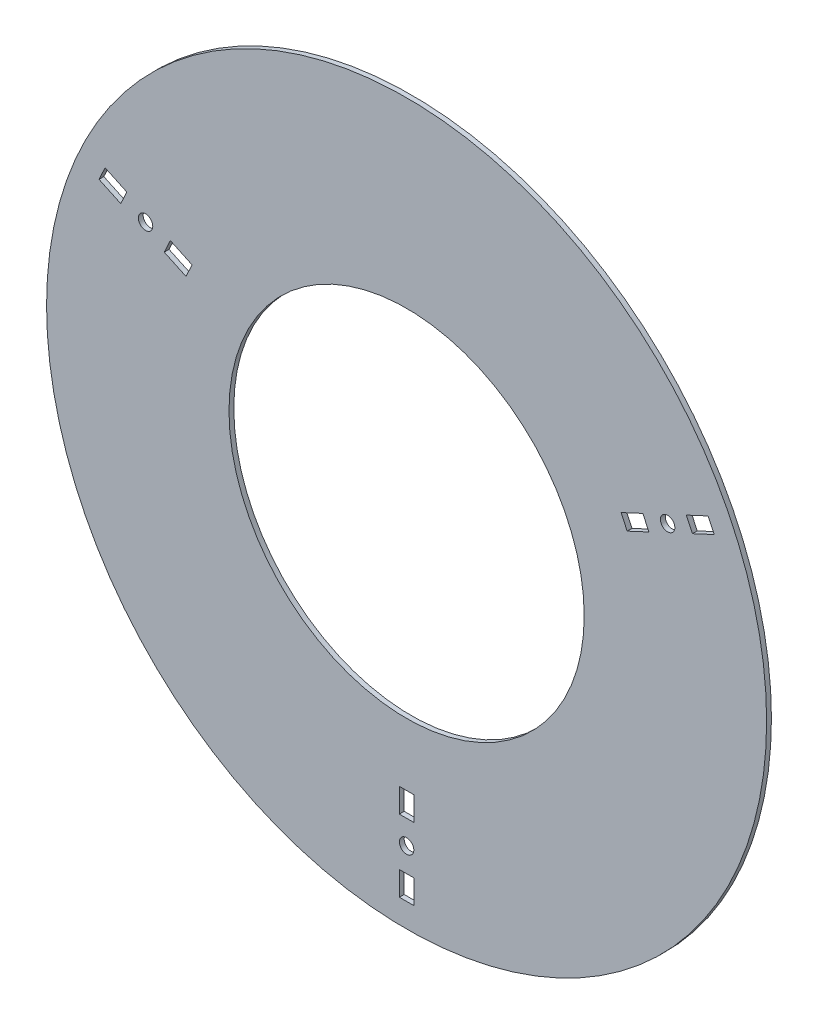
ISO-10303-21;
HEADER;
FILE_DESCRIPTION(('STEP AP214'),'2;1');
FILE_NAME('part.step','',(''),(''),'','','');
FILE_SCHEMA(('AUTOMOTIVE_DESIGN { 1 0 10303 214 1 1 1 1 }'));
ENDSEC;
DATA;
#1=APPLICATION_CONTEXT('core data for automotive mechanical design processes');
#2=APPLICATION_PROTOCOL_DEFINITION('international standard','automotive_design',2000,#1);
#3=PRODUCT_CONTEXT('',#1,'mechanical');
#4=PRODUCT('Part','Part','',(#3));
#5=PRODUCT_RELATED_PRODUCT_CATEGORY('part','',(#4));
#6=PRODUCT_DEFINITION_FORMATION('','',#4);
#7=PRODUCT_DEFINITION_CONTEXT('part definition',#1,'design');
#8=PRODUCT_DEFINITION('design','',#6,#7);
#9=PRODUCT_DEFINITION_SHAPE('','',#8);
#10=(LENGTH_UNIT() NAMED_UNIT(*) SI_UNIT(.MILLI.,.METRE.));
#11=(NAMED_UNIT(*) PLANE_ANGLE_UNIT() SI_UNIT($,.RADIAN.));
#12=(NAMED_UNIT(*) SI_UNIT($,.STERADIAN.) SOLID_ANGLE_UNIT());
#13=UNCERTAINTY_MEASURE_WITH_UNIT(LENGTH_MEASURE(1.E-05),#10,'distance_accuracy_value','');
#14=(GEOMETRIC_REPRESENTATION_CONTEXT(3) GLOBAL_UNCERTAINTY_ASSIGNED_CONTEXT((#13)) GLOBAL_UNIT_ASSIGNED_CONTEXT((#10,
#11,#12)) REPRESENTATION_CONTEXT('',''));
#15=CARTESIAN_POINT('',(0.,0.,0.));
#16=DIRECTION('',(0.,0.,1.));
#17=DIRECTION('',(1.,0.,0.));
#18=AXIS2_PLACEMENT_3D('',#15,#16,#17);
#19=CARTESIAN_POINT('',(0.,0.,1.));
#20=DIRECTION('',(0.,0.,1.));
#21=DIRECTION('',(1.,0.,0.));
#22=AXIS2_PLACEMENT_3D('',#19,#20,#21);
#23=PLANE('',#22);
#24=DIRECTION('',(0.906307787036649,-0.422618261740702,0.));
#25=VECTOR('',#24,1.);
#26=CARTESIAN_POINT('',(-50.4808556796267,21.8845427151837,1.));
#27=LINE('',#26,#25);
#28=CARTESIAN_POINT('',(-50.4808556796267,21.8845427151837,1.));
#29=VERTEX_POINT('',#28);
#30=CARTESIAN_POINT('',(-45.9493167444435,19.7714514064802,1.));
#31=VERTEX_POINT('',#30);
#32=EDGE_CURVE('E202',#29,#31,#27,.T.);
#33=ORIENTED_EDGE('',*,*,#32,.F.);
#34=DIRECTION('',(-0.422618261740704,-0.906307787036648,0.));
#35=VECTOR('',#34,1.);
#36=CARTESIAN_POINT('',(-49.2130008944046,24.6034660762937,1.));
#37=LINE('',#36,#35);
#38=CARTESIAN_POINT('',(-49.2130008944046,24.6034660762937,1.));
#39=VERTEX_POINT('',#38);
#40=EDGE_CURVE('E194',#39,#29,#37,.T.);
#41=ORIENTED_EDGE('',*,*,#40,.F.);
#42=DIRECTION('',(-0.906307787036648,0.422618261740704,0.));
#43=VECTOR('',#42,1.);
#44=CARTESIAN_POINT('',(-49.2130008944046,24.6034660762937,1.));
#45=LINE('',#44,#43);
#46=CARTESIAN_POINT('',(-44.6814619592213,22.4903747675901,1.));
#47=VERTEX_POINT('',#46);
#48=EDGE_CURVE('E217',#47,#39,#45,.T.);
#49=ORIENTED_EDGE('',*,*,#48,.F.);
#50=DIRECTION('',(0.422618261740703,0.906307787036648,0.));
#51=VECTOR('',#50,1.);
#52=CARTESIAN_POINT('',(-44.6814619592213,22.4903747675901,1.));
#53=LINE('',#52,#51);
#54=EDGE_CURVE('E215',#31,#47,#53,.T.);
#55=ORIENTED_EDGE('',*,*,#54,.F.);
#56=EDGE_LOOP('',(#33,#41,#49,#55));
#57=FACE_BOUND('',#56,.T.);
#58=DIRECTION('',(-0.906307787036649,0.422618261740702,0.));
#59=VECTOR('',#58,1.);
#60=CARTESIAN_POINT('',(-58.2760787647711,28.8296486937007,1.));
#61=LINE('',#60,#59);
#62=CARTESIAN_POINT('',(-58.2760787647711,28.8296486937007,1.));
#63=VERTEX_POINT('',#62);
#64=CARTESIAN_POINT('',(-62.8076176999543,30.9427400024042,1.));
#65=VERTEX_POINT('',#64);
#66=EDGE_CURVE('E235',#63,#65,#61,.T.);
#67=ORIENTED_EDGE('',*,*,#66,.F.);
#68=DIRECTION('',(0.422618261740704,0.906307787036648,0.));
#69=VECTOR('',#68,1.);
#70=CARTESIAN_POINT('',(-58.2760787647711,28.8296486937007,1.));
#71=LINE('',#70,#69);
#72=CARTESIAN_POINT('',(-59.5439335499932,26.1107253325907,1.));
#73=VERTEX_POINT('',#72);
#74=EDGE_CURVE('E233',#73,#63,#71,.T.);
#75=ORIENTED_EDGE('',*,*,#74,.F.);
#76=DIRECTION('',(0.906307787036648,-0.422618261740704,0.));
#77=VECTOR('',#76,1.);
#78=CARTESIAN_POINT('',(-59.5439335499932,26.1107253325907,1.));
#79=LINE('',#78,#77);
#80=CARTESIAN_POINT('',(-64.0754724851764,28.2238166412943,1.));
#81=VERTEX_POINT('',#80);
#82=EDGE_CURVE('E241',#81,#73,#79,.T.);
#83=ORIENTED_EDGE('',*,*,#82,.F.);
#84=DIRECTION('',(-0.422618261740703,-0.906307787036648,0.));
#85=VECTOR('',#84,1.);
#86=CARTESIAN_POINT('',(-62.8076176999543,30.9427400024042,1.));
#87=LINE('',#86,#85);
#88=EDGE_CURVE('E238',#65,#81,#87,.T.);
#89=ORIENTED_EDGE('',*,*,#88,.F.);
#90=EDGE_LOOP('',(#67,#75,#83,#89));
#91=FACE_BOUND('',#90,.T.);
#92=CARTESIAN_POINT('',(54.3784672221989,25.3570957044422,1.));
#93=DIRECTION('',(0.,0.,1.));
#94=DIRECTION('',(1.,0.,0.));
#95=AXIS2_PLACEMENT_3D('',#92,#93,#94);
#96=CIRCLE('',#95,1.5);
#97=CARTESIAN_POINT('',(55.8784672221989,25.3570957044422,1.));
#98=VERTEX_POINT('',#97);
#99=EDGE_CURVE('E264',#98,#98,#96,.T.);
#100=ORIENTED_EDGE('',*,*,#99,.F.);
#101=EDGE_LOOP('',(#100));
#102=FACE_BOUND('',#101,.T.);
#103=DIRECTION('',(0.,-1.,0.));
#104=VECTOR('',#103,1.);
#105=CARTESIAN_POINT('',(-1.5,-65.,1.));
#106=LINE('',#105,#104);
#107=CARTESIAN_POINT('',(-1.5,-65.,1.));
#108=VERTEX_POINT('',#107);
#109=CARTESIAN_POINT('',(-1.5,-70.,1.));
#110=VERTEX_POINT('',#109);
#111=EDGE_CURVE('E340',#108,#110,#106,.T.);
#112=ORIENTED_EDGE('',*,*,#111,.F.);
#113=DIRECTION('',(-1.,0.,0.));
#114=VECTOR('',#113,1.);
#115=CARTESIAN_POINT('',(1.5,-65.,1.));
#116=LINE('',#115,#114);
#117=CARTESIAN_POINT('',(1.5,-65.,1.));
#118=VERTEX_POINT('',#117);
#119=EDGE_CURVE('E338',#118,#108,#116,.T.);
#120=ORIENTED_EDGE('',*,*,#119,.F.);
#121=DIRECTION('',(0.,1.,0.));
#122=VECTOR('',#121,1.);
#123=CARTESIAN_POINT('',(1.5,-65.,1.));
#124=LINE('',#123,#122);
#125=CARTESIAN_POINT('',(1.5,-70.,1.));
#126=VERTEX_POINT('',#125);
#127=EDGE_CURVE('E346',#126,#118,#124,.T.);
#128=ORIENTED_EDGE('',*,*,#127,.F.);
#129=DIRECTION('',(1.,0.,0.));
#130=VECTOR('',#129,1.);
#131=CARTESIAN_POINT('',(1.5,-70.,1.));
#132=LINE('',#131,#130);
#133=EDGE_CURVE('E343',#110,#126,#132,.T.);
#134=ORIENTED_EDGE('',*,*,#133,.F.);
#135=EDGE_LOOP('',(#112,#120,#128,#134));
#136=FACE_BOUND('',#135,.T.);
#137=DIRECTION('',(0.,1.,0.));
#138=VECTOR('',#137,1.);
#139=CARTESIAN_POINT('',(1.5,-55.,1.));
#140=LINE('',#139,#138);
#141=CARTESIAN_POINT('',(1.5,-55.,1.));
#142=VERTEX_POINT('',#141);
#143=CARTESIAN_POINT('',(1.5,-50.,1.));
#144=VERTEX_POINT('',#143);
#145=EDGE_CURVE('E371',#142,#144,#140,.T.);
#146=ORIENTED_EDGE('',*,*,#145,.F.);
#147=DIRECTION('',(1.,0.,0.));
#148=VECTOR('',#147,1.);
#149=CARTESIAN_POINT('',(1.5,-55.,1.));
#150=LINE('',#149,#148);
#151=CARTESIAN_POINT('',(-1.5,-55.,1.));
#152=VERTEX_POINT('',#151);
#153=EDGE_CURVE('E369',#152,#142,#150,.T.);
#154=ORIENTED_EDGE('',*,*,#153,.F.);
#155=DIRECTION('',(0.,-1.,0.));
#156=VECTOR('',#155,1.);
#157=CARTESIAN_POINT('',(-1.5,-55.,1.));
#158=LINE('',#157,#156);
#159=CARTESIAN_POINT('',(-1.5,-50.,1.));
#160=VERTEX_POINT('',#159);
#161=EDGE_CURVE('E377',#160,#152,#158,.T.);
#162=ORIENTED_EDGE('',*,*,#161,.F.);
#163=DIRECTION('',(-1.,0.,0.));
#164=VECTOR('',#163,1.);
#165=CARTESIAN_POINT('',(1.5,-50.,1.));
#166=LINE('',#165,#164);
#167=EDGE_CURVE('E374',#144,#160,#166,.T.);
#168=ORIENTED_EDGE('',*,*,#167,.F.);
#169=EDGE_LOOP('',(#146,#154,#162,#168));
#170=FACE_BOUND('',#169,.T.);
#171=CARTESIAN_POINT('',(0.,0.,1.));
#172=DIRECTION('',(0.,0.,1.));
#173=DIRECTION('',(1.,0.,0.));
#174=AXIS2_PLACEMENT_3D('',#171,#172,#173);
#175=CIRCLE('',#174,37.);
#176=CARTESIAN_POINT('',(37.,0.,1.));
#177=VERTEX_POINT('',#176);
#178=EDGE_CURVE('E400',#177,#177,#175,.T.);
#179=ORIENTED_EDGE('',*,*,#178,.F.);
#180=EDGE_LOOP('',(#179));
#181=FACE_BOUND('',#180,.T.);
#182=CARTESIAN_POINT('',(0.,0.,1.));
#183=DIRECTION('',(0.,0.,1.));
#184=DIRECTION('',(1.,0.,0.));
#185=AXIS2_PLACEMENT_3D('',#182,#183,#184);
#186=CIRCLE('',#185,75.);
#187=CARTESIAN_POINT('',(75.,0.,1.));
#188=VERTEX_POINT('',#187);
#189=EDGE_CURVE('E11',#188,#188,#186,.T.);
#190=ORIENTED_EDGE('',*,*,#189,.T.);
#191=EDGE_LOOP('',(#190));
#192=FACE_BOUND('',#191,.T.);
#193=CARTESIAN_POINT('',(0.,-60.,1.));
#194=DIRECTION('',(0.,0.,1.));
#195=DIRECTION('',(1.,0.,0.));
#196=AXIS2_PLACEMENT_3D('',#193,#194,#195);
#197=CIRCLE('',#196,1.5);
#198=CARTESIAN_POINT('',(1.5,-60.,1.));
#199=VERTEX_POINT('',#198);
#200=EDGE_CURVE('E332',#199,#199,#197,.T.);
#201=ORIENTED_EDGE('',*,*,#200,.F.);
#202=EDGE_LOOP('',(#201));
#203=FACE_BOUND('',#202,.T.);
#204=DIRECTION('',(-0.906307787036648,-0.422618261740704,0.));
#205=VECTOR('',#204,1.);
#206=CARTESIAN_POINT('',(49.2130008944046,24.6034660762937,1.));
#207=LINE('',#206,#205);
#208=CARTESIAN_POINT('',(49.2130008944046,24.6034660762937,1.));
#209=VERTEX_POINT('',#208);
#210=CARTESIAN_POINT('',(44.6814619592214,22.4903747675902,1.));
#211=VERTEX_POINT('',#210);
#212=EDGE_CURVE('E303',#209,#211,#207,.T.);
#213=ORIENTED_EDGE('',*,*,#212,.F.);
#214=DIRECTION('',(-0.422618261740704,0.906307787036648,0.));
#215=VECTOR('',#214,1.);
#216=CARTESIAN_POINT('',(49.2130008944046,24.6034660762937,1.));
#217=LINE('',#216,#215);
#218=CARTESIAN_POINT('',(50.4808556796268,21.8845427151838,1.));
#219=VERTEX_POINT('',#218);
#220=EDGE_CURVE('E301',#219,#209,#217,.T.);
#221=ORIENTED_EDGE('',*,*,#220,.F.);
#222=DIRECTION('',(0.906307787036648,0.422618261740703,0.));
#223=VECTOR('',#222,1.);
#224=CARTESIAN_POINT('',(50.4808556796268,21.8845427151838,1.));
#225=LINE('',#224,#223);
#226=CARTESIAN_POINT('',(45.9493167444435,19.7714514064802,1.));
#227=VERTEX_POINT('',#226);
#228=EDGE_CURVE('E309',#227,#219,#225,.T.);
#229=ORIENTED_EDGE('',*,*,#228,.F.);
#230=DIRECTION('',(0.422618261740703,-0.906307787036648,0.));
#231=VECTOR('',#230,1.);
#232=CARTESIAN_POINT('',(44.6814619592214,22.4903747675902,1.));
#233=LINE('',#232,#231);
#234=EDGE_CURVE('E306',#211,#227,#233,.T.);
#235=ORIENTED_EDGE('',*,*,#234,.F.);
#236=EDGE_LOOP('',(#213,#221,#229,#235));
#237=FACE_BOUND('',#236,.T.);
#238=DIRECTION('',(0.906307787036648,0.422618261740704,0.));
#239=VECTOR('',#238,1.);
#240=CARTESIAN_POINT('',(59.5439335499932,26.1107253325908,1.));
#241=LINE('',#240,#239);
#242=CARTESIAN_POINT('',(59.5439335499932,26.1107253325908,1.));
#243=VERTEX_POINT('',#242);
#244=CARTESIAN_POINT('',(64.0754724851765,28.2238166412943,1.));
#245=VERTEX_POINT('',#244);
#246=EDGE_CURVE('E272',#243,#245,#241,.T.);
#247=ORIENTED_EDGE('',*,*,#246,.F.);
#248=DIRECTION('',(0.422618261740704,-0.906307787036648,0.));
#249=VECTOR('',#248,1.);
#250=CARTESIAN_POINT('',(58.2760787647711,28.8296486937007,1.));
#251=LINE('',#250,#249);
#252=CARTESIAN_POINT('',(58.2760787647711,28.8296486937007,1.));
#253=VERTEX_POINT('',#252);
#254=EDGE_CURVE('E270',#253,#243,#251,.T.);
#255=ORIENTED_EDGE('',*,*,#254,.F.);
#256=DIRECTION('',(-0.906307787036648,-0.422618261740703,0.));
#257=VECTOR('',#256,1.);
#258=CARTESIAN_POINT('',(58.2760787647711,28.8296486937007,1.));
#259=LINE('',#258,#257);
#260=CARTESIAN_POINT('',(62.8076176999544,30.9427400024042,1.));
#261=VERTEX_POINT('',#260);
#262=EDGE_CURVE('E278',#261,#253,#259,.T.);
#263=ORIENTED_EDGE('',*,*,#262,.F.);
#264=DIRECTION('',(-0.422618261740703,0.906307787036648,0.));
#265=VECTOR('',#264,1.);
#266=CARTESIAN_POINT('',(62.8076176999544,30.9427400024042,1.));
#267=LINE('',#266,#265);
#268=EDGE_CURVE('E275',#245,#261,#267,.T.);
#269=ORIENTED_EDGE('',*,*,#268,.F.);
#270=EDGE_LOOP('',(#247,#255,#263,#269));
#271=FACE_BOUND('',#270,.T.);
#272=CARTESIAN_POINT('',(-54.3784672221989,25.3570957044422,1.));
#273=DIRECTION('',(0.,0.,1.));
#274=DIRECTION('',(1.,0.,0.));
#275=AXIS2_PLACEMENT_3D('',#272,#273,#274);
#276=CIRCLE('',#275,1.5);
#277=CARTESIAN_POINT('',(-52.8784672221989,25.3570957044422,1.));
#278=VERTEX_POINT('',#277);
#279=EDGE_CURVE('E223',#278,#278,#276,.T.);
#280=ORIENTED_EDGE('',*,*,#279,.F.);
#281=EDGE_LOOP('',(#280));
#282=FACE_BOUND('',#281,.T.);
#283=ADVANCED_FACE('F33',(#57,#91,#102,#136,#170,#181,#192,#203,#237,#271,#282),#23,.T.);
#284=CARTESIAN_POINT('',(0.,0.,0.));
#285=DIRECTION('',(0.,0.,1.));
#286=DIRECTION('',(1.,0.,0.));
#287=AXIS2_PLACEMENT_3D('',#284,#285,#286);
#288=PLANE('',#287);
#289=DIRECTION('',(0.422618261740704,0.906307787036648,0.));
#290=VECTOR('',#289,1.);
#291=CARTESIAN_POINT('',(-58.2760787647711,28.8296486937007,0.));
#292=LINE('',#291,#290);
#293=CARTESIAN_POINT('',(-59.5439335499932,26.1107253325907,0.));
#294=VERTEX_POINT('',#293);
#295=CARTESIAN_POINT('',(-58.2760787647711,28.8296486937007,0.));
#296=VERTEX_POINT('',#295);
#297=EDGE_CURVE('E210',#294,#296,#292,.T.);
#298=ORIENTED_EDGE('',*,*,#297,.T.);
#299=DIRECTION('',(-0.906307787036649,0.422618261740702,0.));
#300=VECTOR('',#299,1.);
#301=CARTESIAN_POINT('',(-58.2760787647711,28.8296486937007,0.));
#302=LINE('',#301,#300);
#303=CARTESIAN_POINT('',(-62.8076176999543,30.9427400024042,0.));
#304=VERTEX_POINT('',#303);
#305=EDGE_CURVE('E246',#296,#304,#302,.T.);
#306=ORIENTED_EDGE('',*,*,#305,.T.);
#307=DIRECTION('',(-0.422618261740703,-0.906307787036648,0.));
#308=VECTOR('',#307,1.);
#309=CARTESIAN_POINT('',(-62.8076176999543,30.9427400024042,0.));
#310=LINE('',#309,#308);
#311=CARTESIAN_POINT('',(-64.0754724851764,28.2238166412943,0.));
#312=VERTEX_POINT('',#311);
#313=EDGE_CURVE('E249',#304,#312,#310,.T.);
#314=ORIENTED_EDGE('',*,*,#313,.T.);
#315=DIRECTION('',(0.906307787036648,-0.422618261740704,0.));
#316=VECTOR('',#315,1.);
#317=CARTESIAN_POINT('',(-59.5439335499932,26.1107253325907,0.));
#318=LINE('',#317,#316);
#319=EDGE_CURVE('E236',#312,#294,#318,.T.);
#320=ORIENTED_EDGE('',*,*,#319,.T.);
#321=EDGE_LOOP('',(#298,#306,#314,#320));
#322=FACE_BOUND('',#321,.T.);
#323=DIRECTION('',(-0.422618261740704,0.906307787036648,0.));
#324=VECTOR('',#323,1.);
#325=CARTESIAN_POINT('',(49.2130008944046,24.6034660762937,0.));
#326=LINE('',#325,#324);
#327=CARTESIAN_POINT('',(50.4808556796267,21.8845427151837,0.));
#328=VERTEX_POINT('',#327);
#329=CARTESIAN_POINT('',(49.2130008944046,24.6034660762937,0.));
#330=VERTEX_POINT('',#329);
#331=EDGE_CURVE('E300',#328,#330,#326,.T.);
#332=ORIENTED_EDGE('',*,*,#331,.T.);
#333=DIRECTION('',(-0.906307787036648,-0.422618261740704,0.));
#334=VECTOR('',#333,1.);
#335=CARTESIAN_POINT('',(49.2130008944046,24.6034660762937,0.));
#336=LINE('',#335,#334);
#337=CARTESIAN_POINT('',(44.6814619592214,22.4903747675902,0.));
#338=VERTEX_POINT('',#337);
#339=EDGE_CURVE('E314',#330,#338,#336,.T.);
#340=ORIENTED_EDGE('',*,*,#339,.T.);
#341=DIRECTION('',(0.422618261740703,-0.906307787036648,0.));
#342=VECTOR('',#341,1.);
#343=CARTESIAN_POINT('',(44.6814619592214,22.4903747675902,0.));
#344=LINE('',#343,#342);
#345=CARTESIAN_POINT('',(45.9493167444435,19.7714514064802,0.));
#346=VERTEX_POINT('',#345);
#347=EDGE_CURVE('E317',#338,#346,#344,.T.);
#348=ORIENTED_EDGE('',*,*,#347,.T.);
#349=DIRECTION('',(0.906307787036648,0.422618261740703,0.));
#350=VECTOR('',#349,1.);
#351=CARTESIAN_POINT('',(50.4808556796268,21.8845427151838,0.));
#352=LINE('',#351,#350);
#353=EDGE_CURVE('E304',#346,#328,#352,.T.);
#354=ORIENTED_EDGE('',*,*,#353,.T.);
#355=EDGE_LOOP('',(#332,#340,#348,#354));
#356=FACE_BOUND('',#355,.T.);
#357=DIRECTION('',(1.,0.,0.));
#358=VECTOR('',#357,1.);
#359=CARTESIAN_POINT('',(1.5,-55.,0.));
#360=LINE('',#359,#358);
#361=CARTESIAN_POINT('',(-1.5,-55.,0.));
#362=VERTEX_POINT('',#361);
#363=CARTESIAN_POINT('',(1.5,-55.,0.));
#364=VERTEX_POINT('',#363);
#365=EDGE_CURVE('E368',#362,#364,#360,.T.);
#366=ORIENTED_EDGE('',*,*,#365,.T.);
#367=DIRECTION('',(0.,1.,0.));
#368=VECTOR('',#367,1.);
#369=CARTESIAN_POINT('',(1.5,-55.,0.));
#370=LINE('',#369,#368);
#371=CARTESIAN_POINT('',(1.5,-50.,0.));
#372=VERTEX_POINT('',#371);
#373=EDGE_CURVE('E382',#364,#372,#370,.T.);
#374=ORIENTED_EDGE('',*,*,#373,.T.);
#375=DIRECTION('',(-1.,0.,0.));
#376=VECTOR('',#375,1.);
#377=CARTESIAN_POINT('',(1.5,-50.,0.));
#378=LINE('',#377,#376);
#379=CARTESIAN_POINT('',(-1.5,-50.,0.));
#380=VERTEX_POINT('',#379);
#381=EDGE_CURVE('E385',#372,#380,#378,.T.);
#382=ORIENTED_EDGE('',*,*,#381,.T.);
#383=DIRECTION('',(0.,-1.,0.));
#384=VECTOR('',#383,1.);
#385=CARTESIAN_POINT('',(-1.5,-55.,0.));
#386=LINE('',#385,#384);
#387=EDGE_CURVE('E372',#380,#362,#386,.T.);
#388=ORIENTED_EDGE('',*,*,#387,.T.);
#389=EDGE_LOOP('',(#366,#374,#382,#388));
#390=FACE_BOUND('',#389,.T.);
#391=CARTESIAN_POINT('',(0.,0.,0.));
#392=DIRECTION('',(0.,0.,1.));
#393=DIRECTION('',(1.,0.,0.));
#394=AXIS2_PLACEMENT_3D('',#391,#392,#393);
#395=CIRCLE('',#394,75.);
#396=CARTESIAN_POINT('',(75.,0.,0.));
#397=VERTEX_POINT('',#396);
#398=EDGE_CURVE('E37',#397,#397,#395,.T.);
#399=ORIENTED_EDGE('',*,*,#398,.F.);
#400=EDGE_LOOP('',(#399));
#401=FACE_BOUND('',#400,.T.);
#402=CARTESIAN_POINT('',(0.,0.,0.));
#403=DIRECTION('',(0.,0.,1.));
#404=DIRECTION('',(1.,0.,0.));
#405=AXIS2_PLACEMENT_3D('',#402,#403,#404);
#406=CIRCLE('',#405,37.);
#407=CARTESIAN_POINT('',(37.,0.,0.));
#408=VERTEX_POINT('',#407);
#409=EDGE_CURVE('E399',#408,#408,#406,.T.);
#410=ORIENTED_EDGE('',*,*,#409,.T.);
#411=EDGE_LOOP('',(#410));
#412=FACE_BOUND('',#411,.T.);
#413=DIRECTION('',(-1.,0.,0.));
#414=VECTOR('',#413,1.);
#415=CARTESIAN_POINT('',(1.5,-65.,0.));
#416=LINE('',#415,#414);
#417=CARTESIAN_POINT('',(1.5,-65.,0.));
#418=VERTEX_POINT('',#417);
#419=CARTESIAN_POINT('',(-1.5,-65.,0.));
#420=VERTEX_POINT('',#419);
#421=EDGE_CURVE('E335',#418,#420,#416,.T.);
#422=ORIENTED_EDGE('',*,*,#421,.T.);
#423=DIRECTION('',(0.,-1.,0.));
#424=VECTOR('',#423,1.);
#425=CARTESIAN_POINT('',(-1.5,-65.,0.));
#426=LINE('',#425,#424);
#427=CARTESIAN_POINT('',(-1.5,-70.,0.));
#428=VERTEX_POINT('',#427);
#429=EDGE_CURVE('E351',#420,#428,#426,.T.);
#430=ORIENTED_EDGE('',*,*,#429,.T.);
#431=DIRECTION('',(1.,0.,0.));
#432=VECTOR('',#431,1.);
#433=CARTESIAN_POINT('',(1.5,-70.,0.));
#434=LINE('',#433,#432);
#435=CARTESIAN_POINT('',(1.5,-70.,0.));
#436=VERTEX_POINT('',#435);
#437=EDGE_CURVE('E354',#428,#436,#434,.T.);
#438=ORIENTED_EDGE('',*,*,#437,.T.);
#439=DIRECTION('',(0.,1.,0.));
#440=VECTOR('',#439,1.);
#441=CARTESIAN_POINT('',(1.5,-65.,0.));
#442=LINE('',#441,#440);
#443=EDGE_CURVE('E341',#436,#418,#442,.T.);
#444=ORIENTED_EDGE('',*,*,#443,.T.);
#445=EDGE_LOOP('',(#422,#430,#438,#444));
#446=FACE_BOUND('',#445,.T.);
#447=CARTESIAN_POINT('',(0.,-60.,0.));
#448=DIRECTION('',(0.,0.,1.));
#449=DIRECTION('',(1.,0.,0.));
#450=AXIS2_PLACEMENT_3D('',#447,#448,#449);
#451=CIRCLE('',#450,1.5);
#452=CARTESIAN_POINT('',(1.5,-60.,0.));
#453=VERTEX_POINT('',#452);
#454=EDGE_CURVE('E331',#453,#453,#451,.T.);
#455=ORIENTED_EDGE('',*,*,#454,.T.);
#456=EDGE_LOOP('',(#455));
#457=FACE_BOUND('',#456,.T.);
#458=DIRECTION('',(0.422618261740704,-0.906307787036648,0.));
#459=VECTOR('',#458,1.);
#460=CARTESIAN_POINT('',(58.2760787647711,28.8296486937007,0.));
#461=LINE('',#460,#459);
#462=CARTESIAN_POINT('',(58.2760787647711,28.8296486937007,0.));
#463=VERTEX_POINT('',#462);
#464=CARTESIAN_POINT('',(59.5439335499932,26.1107253325908,0.));
#465=VERTEX_POINT('',#464);
#466=EDGE_CURVE('E267',#463,#465,#461,.T.);
#467=ORIENTED_EDGE('',*,*,#466,.T.);
#468=DIRECTION('',(0.906307787036648,0.422618261740704,0.));
#469=VECTOR('',#468,1.);
#470=CARTESIAN_POINT('',(59.5439335499932,26.1107253325908,0.));
#471=LINE('',#470,#469);
#472=CARTESIAN_POINT('',(64.0754724851765,28.2238166412943,0.));
#473=VERTEX_POINT('',#472);
#474=EDGE_CURVE('E283',#465,#473,#471,.T.);
#475=ORIENTED_EDGE('',*,*,#474,.T.);
#476=DIRECTION('',(-0.422618261740703,0.906307787036648,0.));
#477=VECTOR('',#476,1.);
#478=CARTESIAN_POINT('',(62.8076176999544,30.9427400024042,0.));
#479=LINE('',#478,#477);
#480=CARTESIAN_POINT('',(62.8076176999544,30.9427400024042,0.));
#481=VERTEX_POINT('',#480);
#482=EDGE_CURVE('E286',#473,#481,#479,.T.);
#483=ORIENTED_EDGE('',*,*,#482,.T.);
#484=DIRECTION('',(-0.906307787036648,-0.422618261740703,0.));
#485=VECTOR('',#484,1.);
#486=CARTESIAN_POINT('',(58.2760787647711,28.8296486937007,0.));
#487=LINE('',#486,#485);
#488=EDGE_CURVE('E273',#481,#463,#487,.T.);
#489=ORIENTED_EDGE('',*,*,#488,.T.);
#490=EDGE_LOOP('',(#467,#475,#483,#489));
#491=FACE_BOUND('',#490,.T.);
#492=CARTESIAN_POINT('',(54.3784672221989,25.3570957044422,0.));
#493=DIRECTION('',(0.,0.,1.));
#494=DIRECTION('',(1.,0.,0.));
#495=AXIS2_PLACEMENT_3D('',#492,#493,#494);
#496=CIRCLE('',#495,1.5);
#497=CARTESIAN_POINT('',(55.8784672221989,25.3570957044422,0.));
#498=VERTEX_POINT('',#497);
#499=EDGE_CURVE('E263',#498,#498,#496,.T.);
#500=ORIENTED_EDGE('',*,*,#499,.T.);
#501=EDGE_LOOP('',(#500));
#502=FACE_BOUND('',#501,.T.);
#503=DIRECTION('',(-0.422618261740704,-0.906307787036648,0.));
#504=VECTOR('',#503,1.);
#505=CARTESIAN_POINT('',(-49.2130008944046,24.6034660762937,0.));
#506=LINE('',#505,#504);
#507=CARTESIAN_POINT('',(-49.2130008944046,24.6034660762937,0.));
#508=VERTEX_POINT('',#507);
#509=CARTESIAN_POINT('',(-50.4808556796267,21.8845427151837,0.));
#510=VERTEX_POINT('',#509);
#511=EDGE_CURVE('E56',#508,#510,#506,.T.);
#512=ORIENTED_EDGE('',*,*,#511,.T.);
#513=DIRECTION('',(0.906307787036649,-0.422618261740702,0.));
#514=VECTOR('',#513,1.);
#515=CARTESIAN_POINT('',(-50.4808556796267,21.8845427151837,0.));
#516=LINE('',#515,#514);
#517=CARTESIAN_POINT('',(-45.9493167444435,19.7714514064802,0.));
#518=VERTEX_POINT('',#517);
#519=EDGE_CURVE('E209',#510,#518,#516,.T.);
#520=ORIENTED_EDGE('',*,*,#519,.T.);
#521=DIRECTION('',(0.422618261740703,0.906307787036648,0.));
#522=VECTOR('',#521,1.);
#523=CARTESIAN_POINT('',(-44.6814619592213,22.4903747675901,0.));
#524=LINE('',#523,#522);
#525=CARTESIAN_POINT('',(-44.6814619592213,22.4903747675901,0.));
#526=VERTEX_POINT('',#525);
#527=EDGE_CURVE('E225',#518,#526,#524,.T.);
#528=ORIENTED_EDGE('',*,*,#527,.T.);
#529=DIRECTION('',(-0.906307787036648,0.422618261740704,0.));
#530=VECTOR('',#529,1.);
#531=CARTESIAN_POINT('',(-49.2130008944046,24.6034660762937,0.));
#532=LINE('',#531,#530);
#533=EDGE_CURVE('E203',#526,#508,#532,.T.);
#534=ORIENTED_EDGE('',*,*,#533,.T.);
#535=EDGE_LOOP('',(#512,#520,#528,#534));
#536=FACE_BOUND('',#535,.T.);
#537=CARTESIAN_POINT('',(-54.3784672221989,25.3570957044422,0.));
#538=DIRECTION('',(0.,0.,1.));
#539=DIRECTION('',(1.,0.,0.));
#540=AXIS2_PLACEMENT_3D('',#537,#538,#539);
#541=CIRCLE('',#540,1.5);
#542=CARTESIAN_POINT('',(-52.8784672221989,25.3570957044422,0.));
#543=VERTEX_POINT('',#542);
#544=EDGE_CURVE('E554',#543,#543,#541,.T.);
#545=ORIENTED_EDGE('',*,*,#544,.T.);
#546=EDGE_LOOP('',(#545));
#547=FACE_BOUND('',#546,.T.);
#548=ADVANCED_FACE('F406',(#322,#356,#390,#401,#412,#446,#457,#491,#502,#536,#547),#288,.F.);
#549=CARTESIAN_POINT('',(0.,0.,1.));
#550=DIRECTION('',(0.,0.,-1.));
#551=DIRECTION('',(-1.,0.,0.));
#552=AXIS2_PLACEMENT_3D('',#549,#550,#551);
#553=CYLINDRICAL_SURFACE('',#552,75.);
#554=ORIENTED_EDGE('',*,*,#189,.F.);
#555=EDGE_LOOP('',(#554));
#556=FACE_BOUND('',#555,.T.);
#557=ORIENTED_EDGE('',*,*,#398,.T.);
#558=EDGE_LOOP('',(#557));
#559=FACE_BOUND('',#558,.T.);
#560=ADVANCED_FACE('F35',(#556,#559),#553,.T.);
#561=CARTESIAN_POINT('',(0.,0.,1.));
#562=DIRECTION('',(0.,0.,-1.));
#563=DIRECTION('',(-1.,0.,0.));
#564=AXIS2_PLACEMENT_3D('',#561,#562,#563);
#565=CYLINDRICAL_SURFACE('',#564,37.);
#566=ORIENTED_EDGE('',*,*,#178,.T.);
#567=EDGE_LOOP('',(#566));
#568=FACE_BOUND('',#567,.T.);
#569=ORIENTED_EDGE('',*,*,#409,.F.);
#570=EDGE_LOOP('',(#569));
#571=FACE_BOUND('',#570,.T.);
#572=ADVANCED_FACE('F409',(#568,#571),#565,.F.);
#573=CARTESIAN_POINT('',(1.5,-55.,1.));
#574=DIRECTION('',(0.,1.,0.));
#575=DIRECTION('',(0.,0.,1.));
#576=AXIS2_PLACEMENT_3D('',#573,#574,#575);
#577=PLANE('',#576);
#578=ORIENTED_EDGE('',*,*,#365,.F.);
#579=DIRECTION('',(0.,0.,-1.));
#580=VECTOR('',#579,1.);
#581=CARTESIAN_POINT('',(-1.5,-55.,1.));
#582=LINE('',#581,#580);
#583=EDGE_CURVE('E379',#152,#362,#582,.T.);
#584=ORIENTED_EDGE('',*,*,#583,.F.);
#585=ORIENTED_EDGE('',*,*,#153,.T.);
#586=DIRECTION('',(0.,0.,-1.));
#587=VECTOR('',#586,1.);
#588=CARTESIAN_POINT('',(1.5,-55.,1.));
#589=LINE('',#588,#587);
#590=EDGE_CURVE('E396',#142,#364,#589,.T.);
#591=ORIENTED_EDGE('',*,*,#590,.T.);
#592=EDGE_LOOP('',(#578,#584,#585,#591));
#593=FACE_BOUND('',#592,.T.);
#594=ADVANCED_FACE('F411',(#593),#577,.T.);
#595=CARTESIAN_POINT('',(1.5,-55.,1.));
#596=DIRECTION('',(-1.,0.,0.));
#597=DIRECTION('',(0.,-1.,0.));
#598=AXIS2_PLACEMENT_3D('',#595,#596,#597);
#599=PLANE('',#598);
#600=ORIENTED_EDGE('',*,*,#373,.F.);
#601=ORIENTED_EDGE('',*,*,#590,.F.);
#602=ORIENTED_EDGE('',*,*,#145,.T.);
#603=DIRECTION('',(0.,0.,-1.));
#604=VECTOR('',#603,1.);
#605=CARTESIAN_POINT('',(1.5,-50.,1.));
#606=LINE('',#605,#604);
#607=EDGE_CURVE('E394',#144,#372,#606,.T.);
#608=ORIENTED_EDGE('',*,*,#607,.T.);
#609=EDGE_LOOP('',(#600,#601,#602,#608));
#610=FACE_BOUND('',#609,.T.);
#611=ADVANCED_FACE('F418',(#610),#599,.T.);
#612=CARTESIAN_POINT('',(1.5,-50.,1.));
#613=DIRECTION('',(0.,-1.,0.));
#614=DIRECTION('',(0.,0.,-1.));
#615=AXIS2_PLACEMENT_3D('',#612,#613,#614);
#616=PLANE('',#615);
#617=ORIENTED_EDGE('',*,*,#381,.F.);
#618=ORIENTED_EDGE('',*,*,#607,.F.);
#619=ORIENTED_EDGE('',*,*,#167,.T.);
#620=DIRECTION('',(0.,0.,-1.));
#621=VECTOR('',#620,1.);
#622=CARTESIAN_POINT('',(-1.5,-50.,1.));
#623=LINE('',#622,#621);
#624=EDGE_CURVE('E392',#160,#380,#623,.T.);
#625=ORIENTED_EDGE('',*,*,#624,.T.);
#626=EDGE_LOOP('',(#617,#618,#619,#625));
#627=FACE_BOUND('',#626,.T.);
#628=ADVANCED_FACE('F451',(#627),#616,.T.);
#629=CARTESIAN_POINT('',(-1.5,-55.,1.));
#630=DIRECTION('',(1.,0.,0.));
#631=DIRECTION('',(0.,1.,0.));
#632=AXIS2_PLACEMENT_3D('',#629,#630,#631);
#633=PLANE('',#632);
#634=ORIENTED_EDGE('',*,*,#387,.F.);
#635=ORIENTED_EDGE('',*,*,#624,.F.);
#636=ORIENTED_EDGE('',*,*,#161,.T.);
#637=ORIENTED_EDGE('',*,*,#583,.T.);
#638=EDGE_LOOP('',(#634,#635,#636,#637));
#639=FACE_BOUND('',#638,.T.);
#640=ADVANCED_FACE('F441',(#639),#633,.T.);
#641=CARTESIAN_POINT('',(1.5,-65.,1.));
#642=DIRECTION('',(0.,-1.,0.));
#643=DIRECTION('',(0.,0.,-1.));
#644=AXIS2_PLACEMENT_3D('',#641,#642,#643);
#645=PLANE('',#644);
#646=ORIENTED_EDGE('',*,*,#421,.F.);
#647=DIRECTION('',(0.,0.,-1.));
#648=VECTOR('',#647,1.);
#649=CARTESIAN_POINT('',(1.5,-65.,1.));
#650=LINE('',#649,#648);
#651=EDGE_CURVE('E348',#118,#418,#650,.T.);
#652=ORIENTED_EDGE('',*,*,#651,.F.);
#653=ORIENTED_EDGE('',*,*,#119,.T.);
#654=DIRECTION('',(0.,0.,-1.));
#655=VECTOR('',#654,1.);
#656=CARTESIAN_POINT('',(-1.5,-65.,1.));
#657=LINE('',#656,#655);
#658=EDGE_CURVE('E365',#108,#420,#657,.T.);
#659=ORIENTED_EDGE('',*,*,#658,.T.);
#660=EDGE_LOOP('',(#646,#652,#653,#659));
#661=FACE_BOUND('',#660,.T.);
#662=ADVANCED_FACE('F458',(#661),#645,.T.);
#663=CARTESIAN_POINT('',(-1.5,-65.,1.));
#664=DIRECTION('',(1.,0.,0.));
#665=DIRECTION('',(0.,1.,0.));
#666=AXIS2_PLACEMENT_3D('',#663,#664,#665);
#667=PLANE('',#666);
#668=ORIENTED_EDGE('',*,*,#429,.F.);
#669=ORIENTED_EDGE('',*,*,#658,.F.);
#670=ORIENTED_EDGE('',*,*,#111,.T.);
#671=DIRECTION('',(0.,0.,-1.));
#672=VECTOR('',#671,1.);
#673=CARTESIAN_POINT('',(-1.5,-70.,1.));
#674=LINE('',#673,#672);
#675=EDGE_CURVE('E363',#110,#428,#674,.T.);
#676=ORIENTED_EDGE('',*,*,#675,.T.);
#677=EDGE_LOOP('',(#668,#669,#670,#676));
#678=FACE_BOUND('',#677,.T.);
#679=ADVANCED_FACE('F464',(#678),#667,.T.);
#680=CARTESIAN_POINT('',(1.5,-70.,1.));
#681=DIRECTION('',(0.,1.,0.));
#682=DIRECTION('',(0.,0.,1.));
#683=AXIS2_PLACEMENT_3D('',#680,#681,#682);
#684=PLANE('',#683);
#685=ORIENTED_EDGE('',*,*,#437,.F.);
#686=ORIENTED_EDGE('',*,*,#675,.F.);
#687=ORIENTED_EDGE('',*,*,#133,.T.);
#688=DIRECTION('',(0.,0.,-1.));
#689=VECTOR('',#688,1.);
#690=CARTESIAN_POINT('',(1.5,-70.,1.));
#691=LINE('',#690,#689);
#692=EDGE_CURVE('E361',#126,#436,#691,.T.);
#693=ORIENTED_EDGE('',*,*,#692,.T.);
#694=EDGE_LOOP('',(#685,#686,#687,#693));
#695=FACE_BOUND('',#694,.T.);
#696=ADVANCED_FACE('F468',(#695),#684,.T.);
#697=CARTESIAN_POINT('',(1.5,-65.,1.));
#698=DIRECTION('',(-1.,0.,0.));
#699=DIRECTION('',(0.,-1.,0.));
#700=AXIS2_PLACEMENT_3D('',#697,#698,#699);
#701=PLANE('',#700);
#702=ORIENTED_EDGE('',*,*,#443,.F.);
#703=ORIENTED_EDGE('',*,*,#692,.F.);
#704=ORIENTED_EDGE('',*,*,#127,.T.);
#705=ORIENTED_EDGE('',*,*,#651,.T.);
#706=EDGE_LOOP('',(#702,#703,#704,#705));
#707=FACE_BOUND('',#706,.T.);
#708=ADVANCED_FACE('F472',(#707),#701,.T.);
#709=CARTESIAN_POINT('',(0.,-60.,1.));
#710=DIRECTION('',(0.,0.,-1.));
#711=DIRECTION('',(-1.,0.,0.));
#712=AXIS2_PLACEMENT_3D('',#709,#710,#711);
#713=CYLINDRICAL_SURFACE('',#712,1.5);
#714=ORIENTED_EDGE('',*,*,#200,.T.);
#715=EDGE_LOOP('',(#714));
#716=FACE_BOUND('',#715,.T.);
#717=ORIENTED_EDGE('',*,*,#454,.F.);
#718=EDGE_LOOP('',(#717));
#719=FACE_BOUND('',#718,.T.);
#720=ADVANCED_FACE('F476',(#716,#719),#713,.F.);
#721=CARTESIAN_POINT('',(49.2130008944046,24.6034660762937,1.));
#722=DIRECTION('',(-0.906307787036648,-0.422618261740704,0.));
#723=DIRECTION('',(0.422618261740704,-0.906307787036648,0.));
#724=AXIS2_PLACEMENT_3D('',#721,#722,#723);
#725=PLANE('',#724);
#726=ORIENTED_EDGE('',*,*,#331,.F.);
#727=DIRECTION('',(0.,0.,-1.));
#728=VECTOR('',#727,1.);
#729=CARTESIAN_POINT('',(50.4808556796268,21.8845427151838,1.));
#730=LINE('',#729,#728);
#731=EDGE_CURVE('E311',#219,#328,#730,.T.);
#732=ORIENTED_EDGE('',*,*,#731,.F.);
#733=ORIENTED_EDGE('',*,*,#220,.T.);
#734=DIRECTION('',(0.,0.,-1.));
#735=VECTOR('',#734,1.);
#736=CARTESIAN_POINT('',(49.2130008944046,24.6034660762937,1.));
#737=LINE('',#736,#735);
#738=EDGE_CURVE('E328',#209,#330,#737,.T.);
#739=ORIENTED_EDGE('',*,*,#738,.T.);
#740=EDGE_LOOP('',(#726,#732,#733,#739));
#741=FACE_BOUND('',#740,.T.);
#742=ADVANCED_FACE('F480',(#741),#725,.T.);
#743=CARTESIAN_POINT('',(49.2130008944046,24.6034660762937,1.));
#744=DIRECTION('',(0.422618261740704,-0.906307787036648,0.));
#745=DIRECTION('',(0.906307787036648,0.422618261740704,0.));
#746=AXIS2_PLACEMENT_3D('',#743,#744,#745);
#747=PLANE('',#746);
#748=ORIENTED_EDGE('',*,*,#339,.F.);
#749=ORIENTED_EDGE('',*,*,#738,.F.);
#750=ORIENTED_EDGE('',*,*,#212,.T.);
#751=DIRECTION('',(0.,0.,-1.));
#752=VECTOR('',#751,1.);
#753=CARTESIAN_POINT('',(44.6814619592214,22.4903747675902,1.));
#754=LINE('',#753,#752);
#755=EDGE_CURVE('E326',#211,#338,#754,.T.);
#756=ORIENTED_EDGE('',*,*,#755,.T.);
#757=EDGE_LOOP('',(#748,#749,#750,#756));
#758=FACE_BOUND('',#757,.T.);
#759=ADVANCED_FACE('F484',(#758),#747,.T.);
#760=CARTESIAN_POINT('',(44.6814619592214,22.4903747675902,1.));
#761=DIRECTION('',(0.906307787036648,0.422618261740703,0.));
#762=DIRECTION('',(-0.422618261740703,0.906307787036648,0.));
#763=AXIS2_PLACEMENT_3D('',#760,#761,#762);
#764=PLANE('',#763);
#765=ORIENTED_EDGE('',*,*,#347,.F.);
#766=ORIENTED_EDGE('',*,*,#755,.F.);
#767=ORIENTED_EDGE('',*,*,#234,.T.);
#768=DIRECTION('',(0.,0.,-1.));
#769=VECTOR('',#768,1.);
#770=CARTESIAN_POINT('',(45.9493167444435,19.7714514064802,1.));
#771=LINE('',#770,#769);
#772=EDGE_CURVE('E324',#227,#346,#771,.T.);
#773=ORIENTED_EDGE('',*,*,#772,.T.);
#774=EDGE_LOOP('',(#765,#766,#767,#773));
#775=FACE_BOUND('',#774,.T.);
#776=ADVANCED_FACE('F488',(#775),#764,.T.);
#777=CARTESIAN_POINT('',(50.4808556796268,21.8845427151838,1.));
#778=DIRECTION('',(-0.422618261740703,0.906307787036648,0.));
#779=DIRECTION('',(-0.906307787036648,-0.422618261740703,0.));
#780=AXIS2_PLACEMENT_3D('',#777,#778,#779);
#781=PLANE('',#780);
#782=ORIENTED_EDGE('',*,*,#353,.F.);
#783=ORIENTED_EDGE('',*,*,#772,.F.);
#784=ORIENTED_EDGE('',*,*,#228,.T.);
#785=ORIENTED_EDGE('',*,*,#731,.T.);
#786=EDGE_LOOP('',(#782,#783,#784,#785));
#787=FACE_BOUND('',#786,.T.);
#788=ADVANCED_FACE('F492',(#787),#781,.T.);
#789=CARTESIAN_POINT('',(58.2760787647711,28.8296486937007,1.));
#790=DIRECTION('',(0.906307787036648,0.422618261740704,0.));
#791=DIRECTION('',(-0.422618261740704,0.906307787036648,0.));
#792=AXIS2_PLACEMENT_3D('',#789,#790,#791);
#793=PLANE('',#792);
#794=ORIENTED_EDGE('',*,*,#466,.F.);
#795=DIRECTION('',(0.,0.,-1.));
#796=VECTOR('',#795,1.);
#797=CARTESIAN_POINT('',(58.2760787647711,28.8296486937007,1.));
#798=LINE('',#797,#796);
#799=EDGE_CURVE('E280',#253,#463,#798,.T.);
#800=ORIENTED_EDGE('',*,*,#799,.F.);
#801=ORIENTED_EDGE('',*,*,#254,.T.);
#802=DIRECTION('',(0.,0.,-1.));
#803=VECTOR('',#802,1.);
#804=CARTESIAN_POINT('',(59.5439335499932,26.1107253325908,1.));
#805=LINE('',#804,#803);
#806=EDGE_CURVE('E297',#243,#465,#805,.T.);
#807=ORIENTED_EDGE('',*,*,#806,.T.);
#808=EDGE_LOOP('',(#794,#800,#801,#807));
#809=FACE_BOUND('',#808,.T.);
#810=ADVANCED_FACE('F496',(#809),#793,.T.);
#811=CARTESIAN_POINT('',(59.5439335499932,26.1107253325908,1.));
#812=DIRECTION('',(-0.422618261740704,0.906307787036648,0.));
#813=DIRECTION('',(-0.906307787036648,-0.422618261740704,0.));
#814=AXIS2_PLACEMENT_3D('',#811,#812,#813);
#815=PLANE('',#814);
#816=ORIENTED_EDGE('',*,*,#474,.F.);
#817=ORIENTED_EDGE('',*,*,#806,.F.);
#818=ORIENTED_EDGE('',*,*,#246,.T.);
#819=DIRECTION('',(0.,0.,-1.));
#820=VECTOR('',#819,1.);
#821=CARTESIAN_POINT('',(64.0754724851765,28.2238166412943,1.));
#822=LINE('',#821,#820);
#823=EDGE_CURVE('E295',#245,#473,#822,.T.);
#824=ORIENTED_EDGE('',*,*,#823,.T.);
#825=EDGE_LOOP('',(#816,#817,#818,#824));
#826=FACE_BOUND('',#825,.T.);
#827=ADVANCED_FACE('F500',(#826),#815,.T.);
#828=CARTESIAN_POINT('',(62.8076176999544,30.9427400024042,1.));
#829=DIRECTION('',(-0.906307787036648,-0.422618261740703,0.));
#830=DIRECTION('',(0.422618261740703,-0.906307787036648,0.));
#831=AXIS2_PLACEMENT_3D('',#828,#829,#830);
#832=PLANE('',#831);
#833=ORIENTED_EDGE('',*,*,#482,.F.);
#834=ORIENTED_EDGE('',*,*,#823,.F.);
#835=ORIENTED_EDGE('',*,*,#268,.T.);
#836=DIRECTION('',(0.,0.,-1.));
#837=VECTOR('',#836,1.);
#838=CARTESIAN_POINT('',(62.8076176999544,30.9427400024042,1.));
#839=LINE('',#838,#837);
#840=EDGE_CURVE('E293',#261,#481,#839,.T.);
#841=ORIENTED_EDGE('',*,*,#840,.T.);
#842=EDGE_LOOP('',(#833,#834,#835,#841));
#843=FACE_BOUND('',#842,.T.);
#844=ADVANCED_FACE('F504',(#843),#832,.T.);
#845=CARTESIAN_POINT('',(58.2760787647711,28.8296486937007,1.));
#846=DIRECTION('',(0.422618261740703,-0.906307787036648,0.));
#847=DIRECTION('',(0.906307787036648,0.422618261740703,0.));
#848=AXIS2_PLACEMENT_3D('',#845,#846,#847);
#849=PLANE('',#848);
#850=ORIENTED_EDGE('',*,*,#488,.F.);
#851=ORIENTED_EDGE('',*,*,#840,.F.);
#852=ORIENTED_EDGE('',*,*,#262,.T.);
#853=ORIENTED_EDGE('',*,*,#799,.T.);
#854=EDGE_LOOP('',(#850,#851,#852,#853));
#855=FACE_BOUND('',#854,.T.);
#856=ADVANCED_FACE('F508',(#855),#849,.T.);
#857=CARTESIAN_POINT('',(54.3784672221989,25.3570957044422,1.));
#858=DIRECTION('',(0.,0.,-1.));
#859=DIRECTION('',(-1.,0.,0.));
#860=AXIS2_PLACEMENT_3D('',#857,#858,#859);
#861=CYLINDRICAL_SURFACE('',#860,1.5);
#862=ORIENTED_EDGE('',*,*,#99,.T.);
#863=EDGE_LOOP('',(#862));
#864=FACE_BOUND('',#863,.T.);
#865=ORIENTED_EDGE('',*,*,#499,.F.);
#866=EDGE_LOOP('',(#865));
#867=FACE_BOUND('',#866,.T.);
#868=ADVANCED_FACE('F512',(#864,#867),#861,.F.);
#869=CARTESIAN_POINT('',(-58.2760787647711,28.8296486937007,1.));
#870=DIRECTION('',(-0.906307787036648,0.422618261740704,0.));
#871=DIRECTION('',(-0.422618261740704,-0.906307787036648,0.));
#872=AXIS2_PLACEMENT_3D('',#869,#870,#871);
#873=PLANE('',#872);
#874=ORIENTED_EDGE('',*,*,#297,.F.);
#875=DIRECTION('',(0.,0.,-1.));
#876=VECTOR('',#875,1.);
#877=CARTESIAN_POINT('',(-59.5439335499932,26.1107253325907,1.));
#878=LINE('',#877,#876);
#879=EDGE_CURVE('E243',#73,#294,#878,.T.);
#880=ORIENTED_EDGE('',*,*,#879,.F.);
#881=ORIENTED_EDGE('',*,*,#74,.T.);
#882=DIRECTION('',(0.,0.,-1.));
#883=VECTOR('',#882,1.);
#884=CARTESIAN_POINT('',(-58.2760787647711,28.8296486937007,1.));
#885=LINE('',#884,#883);
#886=EDGE_CURVE('E260',#63,#296,#885,.T.);
#887=ORIENTED_EDGE('',*,*,#886,.T.);
#888=EDGE_LOOP('',(#874,#880,#881,#887));
#889=FACE_BOUND('',#888,.T.);
#890=ADVANCED_FACE('F516',(#889),#873,.T.);
#891=CARTESIAN_POINT('',(-58.2760787647711,28.8296486937007,1.));
#892=DIRECTION('',(-0.422618261740702,-0.906307787036649,0.));
#893=DIRECTION('',(0.906307787036649,-0.422618261740702,0.));
#894=AXIS2_PLACEMENT_3D('',#891,#892,#893);
#895=PLANE('',#894);
#896=ORIENTED_EDGE('',*,*,#305,.F.);
#897=ORIENTED_EDGE('',*,*,#886,.F.);
#898=ORIENTED_EDGE('',*,*,#66,.T.);
#899=DIRECTION('',(0.,0.,-1.));
#900=VECTOR('',#899,1.);
#901=CARTESIAN_POINT('',(-62.8076176999543,30.9427400024042,1.));
#902=LINE('',#901,#900);
#903=EDGE_CURVE('E258',#65,#304,#902,.T.);
#904=ORIENTED_EDGE('',*,*,#903,.T.);
#905=EDGE_LOOP('',(#896,#897,#898,#904));
#906=FACE_BOUND('',#905,.T.);
#907=ADVANCED_FACE('F520',(#906),#895,.T.);
#908=CARTESIAN_POINT('',(-62.8076176999543,30.9427400024042,1.));
#909=DIRECTION('',(0.906307787036648,-0.422618261740703,0.));
#910=DIRECTION('',(0.422618261740703,0.906307787036648,0.));
#911=AXIS2_PLACEMENT_3D('',#908,#909,#910);
#912=PLANE('',#911);
#913=ORIENTED_EDGE('',*,*,#313,.F.);
#914=ORIENTED_EDGE('',*,*,#903,.F.);
#915=ORIENTED_EDGE('',*,*,#88,.T.);
#916=DIRECTION('',(0.,0.,-1.));
#917=VECTOR('',#916,1.);
#918=CARTESIAN_POINT('',(-64.0754724851764,28.2238166412943,1.));
#919=LINE('',#918,#917);
#920=EDGE_CURVE('E256',#81,#312,#919,.T.);
#921=ORIENTED_EDGE('',*,*,#920,.T.);
#922=EDGE_LOOP('',(#913,#914,#915,#921));
#923=FACE_BOUND('',#922,.T.);
#924=ADVANCED_FACE('F524',(#923),#912,.T.);
#925=CARTESIAN_POINT('',(-59.5439335499932,26.1107253325907,1.));
#926=DIRECTION('',(0.422618261740704,0.906307787036648,0.));
#927=DIRECTION('',(-0.906307787036648,0.422618261740704,0.));
#928=AXIS2_PLACEMENT_3D('',#925,#926,#927);
#929=PLANE('',#928);
#930=ORIENTED_EDGE('',*,*,#319,.F.);
#931=ORIENTED_EDGE('',*,*,#920,.F.);
#932=ORIENTED_EDGE('',*,*,#82,.T.);
#933=ORIENTED_EDGE('',*,*,#879,.T.);
#934=EDGE_LOOP('',(#930,#931,#932,#933));
#935=FACE_BOUND('',#934,.T.);
#936=ADVANCED_FACE('F528',(#935),#929,.T.);
#937=CARTESIAN_POINT('',(-49.2130008944046,24.6034660762937,1.));
#938=DIRECTION('',(0.906307787036648,-0.422618261740704,0.));
#939=DIRECTION('',(0.422618261740704,0.906307787036648,0.));
#940=AXIS2_PLACEMENT_3D('',#937,#938,#939);
#941=PLANE('',#940);
#942=ORIENTED_EDGE('',*,*,#511,.F.);
#943=DIRECTION('',(0.,0.,-1.));
#944=VECTOR('',#943,1.);
#945=CARTESIAN_POINT('',(-49.2130008944046,24.6034660762937,1.));
#946=LINE('',#945,#944);
#947=EDGE_CURVE('E198',#39,#508,#946,.T.);
#948=ORIENTED_EDGE('',*,*,#947,.F.);
#949=ORIENTED_EDGE('',*,*,#40,.T.);
#950=DIRECTION('',(0.,0.,-1.));
#951=VECTOR('',#950,1.);
#952=CARTESIAN_POINT('',(-50.4808556796267,21.8845427151837,1.));
#953=LINE('',#952,#951);
#954=EDGE_CURVE('E197',#29,#510,#953,.T.);
#955=ORIENTED_EDGE('',*,*,#954,.T.);
#956=EDGE_LOOP('',(#942,#948,#949,#955));
#957=FACE_BOUND('',#956,.T.);
#958=ADVANCED_FACE('F196',(#957),#941,.T.);
#959=CARTESIAN_POINT('',(-50.4808556796267,21.8845427151837,1.));
#960=DIRECTION('',(0.422618261740702,0.906307787036649,0.));
#961=DIRECTION('',(-0.906307787036649,0.422618261740702,0.));
#962=AXIS2_PLACEMENT_3D('',#959,#960,#961);
#963=PLANE('',#962);
#964=ORIENTED_EDGE('',*,*,#519,.F.);
#965=ORIENTED_EDGE('',*,*,#954,.F.);
#966=ORIENTED_EDGE('',*,*,#32,.T.);
#967=DIRECTION('',(0.,0.,-1.));
#968=VECTOR('',#967,1.);
#969=CARTESIAN_POINT('',(-45.9493167444435,19.7714514064802,1.));
#970=LINE('',#969,#968);
#971=EDGE_CURVE('E211',#31,#518,#970,.T.);
#972=ORIENTED_EDGE('',*,*,#971,.T.);
#973=EDGE_LOOP('',(#964,#965,#966,#972));
#974=FACE_BOUND('',#973,.T.);
#975=ADVANCED_FACE('F206',(#974),#963,.T.);
#976=CARTESIAN_POINT('',(-44.6814619592213,22.4903747675901,1.));
#977=DIRECTION('',(-0.906307787036648,0.422618261740703,0.));
#978=DIRECTION('',(-0.422618261740703,-0.906307787036648,0.));
#979=AXIS2_PLACEMENT_3D('',#976,#977,#978);
#980=PLANE('',#979);
#981=ORIENTED_EDGE('',*,*,#527,.F.);
#982=ORIENTED_EDGE('',*,*,#971,.F.);
#983=ORIENTED_EDGE('',*,*,#54,.T.);
#984=DIRECTION('',(0.,0.,-1.));
#985=VECTOR('',#984,1.);
#986=CARTESIAN_POINT('',(-44.6814619592213,22.4903747675901,1.));
#987=LINE('',#986,#985);
#988=EDGE_CURVE('E48',#47,#526,#987,.T.);
#989=ORIENTED_EDGE('',*,*,#988,.T.);
#990=EDGE_LOOP('',(#981,#982,#983,#989));
#991=FACE_BOUND('',#990,.T.);
#992=ADVANCED_FACE('F537',(#991),#980,.T.);
#993=CARTESIAN_POINT('',(-49.2130008944046,24.6034660762937,1.));
#994=DIRECTION('',(-0.422618261740704,-0.906307787036648,0.));
#995=DIRECTION('',(0.906307787036648,-0.422618261740704,0.));
#996=AXIS2_PLACEMENT_3D('',#993,#994,#995);
#997=PLANE('',#996);
#998=ORIENTED_EDGE('',*,*,#533,.F.);
#999=ORIENTED_EDGE('',*,*,#988,.F.);
#1000=ORIENTED_EDGE('',*,*,#48,.T.);
#1001=ORIENTED_EDGE('',*,*,#947,.T.);
#1002=EDGE_LOOP('',(#998,#999,#1000,#1001));
#1003=FACE_BOUND('',#1002,.T.);
#1004=ADVANCED_FACE('F540',(#1003),#997,.T.);
#1005=CARTESIAN_POINT('',(-54.3784672221989,25.3570957044422,1.));
#1006=DIRECTION('',(0.,0.,-1.));
#1007=DIRECTION('',(-1.,0.,0.));
#1008=AXIS2_PLACEMENT_3D('',#1005,#1006,#1007);
#1009=CYLINDRICAL_SURFACE('',#1008,1.5);
#1010=ORIENTED_EDGE('',*,*,#279,.T.);
#1011=EDGE_LOOP('',(#1010));
#1012=FACE_BOUND('',#1011,.T.);
#1013=ORIENTED_EDGE('',*,*,#544,.F.);
#1014=EDGE_LOOP('',(#1013));
#1015=FACE_BOUND('',#1014,.T.);
#1016=ADVANCED_FACE('F544',(#1012,#1015),#1009,.F.);
#1017=CLOSED_SHELL('',(#283,#548,#560,#572,#594,#611,#628,#640,#662,#679,#696,#708,#720,#742,
#759,#776,#788,#810,#827,#844,#856,#868,#890,#907,#924,#936,#958,#975,#992,#1004,#1016));
#1018=MANIFOLD_SOLID_BREP('B2',#1017);
#1019=ADVANCED_BREP_SHAPE_REPRESENTATION('',(#18,#1018),#14);
#1020=SHAPE_DEFINITION_REPRESENTATION(#9,#1019);
ENDSEC;
END-ISO-10303-21;
